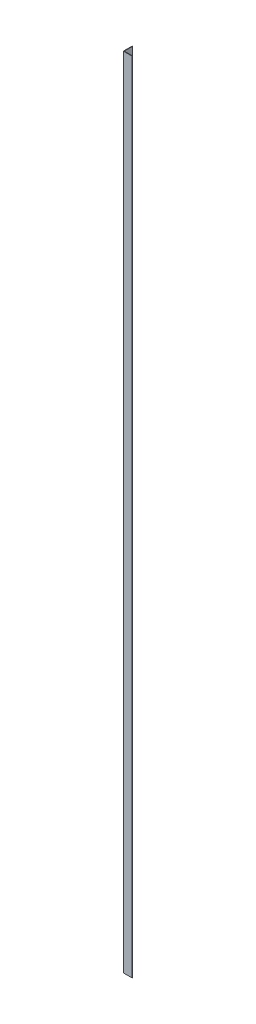
ISO-10303-21;
HEADER;
FILE_DESCRIPTION(('STEP AP214'),'2;1');
FILE_NAME('part.step','',(''),(''),'','','');
FILE_SCHEMA(('AUTOMOTIVE_DESIGN { 1 0 10303 214 1 1 1 1 }'));
ENDSEC;
DATA;
#1=APPLICATION_CONTEXT('core data for automotive mechanical design processes');
#2=APPLICATION_PROTOCOL_DEFINITION('international standard','automotive_design',2000,#1);
#3=PRODUCT_CONTEXT('',#1,'mechanical');
#4=PRODUCT('Part','Part','',(#3));
#5=PRODUCT_RELATED_PRODUCT_CATEGORY('part','',(#4));
#6=PRODUCT_DEFINITION_FORMATION('','',#4);
#7=PRODUCT_DEFINITION_CONTEXT('part definition',#1,'design');
#8=PRODUCT_DEFINITION('design','',#6,#7);
#9=PRODUCT_DEFINITION_SHAPE('','',#8);
#10=(LENGTH_UNIT() NAMED_UNIT(*) SI_UNIT(.MILLI.,.METRE.));
#11=(NAMED_UNIT(*) PLANE_ANGLE_UNIT() SI_UNIT($,.RADIAN.));
#12=(NAMED_UNIT(*) SI_UNIT($,.STERADIAN.) SOLID_ANGLE_UNIT());
#13=UNCERTAINTY_MEASURE_WITH_UNIT(LENGTH_MEASURE(1.E-05),#10,'distance_accuracy_value','');
#14=(GEOMETRIC_REPRESENTATION_CONTEXT(3) GLOBAL_UNCERTAINTY_ASSIGNED_CONTEXT((#13)) GLOBAL_UNIT_ASSIGNED_CONTEXT((#10,
#11,#12)) REPRESENTATION_CONTEXT('',''));
#15=CARTESIAN_POINT('',(0.,0.,0.));
#16=DIRECTION('',(0.,0.,1.));
#17=DIRECTION('',(1.,0.,0.));
#18=AXIS2_PLACEMENT_3D('',#15,#16,#17);
#19=CARTESIAN_POINT('',(1.,1800.,0.));
#20=DIRECTION('',(1.,0.,0.));
#21=DIRECTION('',(0.,0.,-1.));
#22=AXIS2_PLACEMENT_3D('',#19,#20,#21);
#23=PLANE('',#22);
#24=DIRECTION('',(0.,0.,1.));
#25=VECTOR('',#24,1.);
#26=CARTESIAN_POINT('',(1.,0.,0.));
#27=LINE('',#26,#25);
#28=CARTESIAN_POINT('',(1.,0.,-20.));
#29=VERTEX_POINT('',#28);
#30=CARTESIAN_POINT('',(1.,0.,-0.999999999999998));
#31=VERTEX_POINT('',#30);
#32=EDGE_CURVE('E116',#29,#31,#27,.T.);
#33=ORIENTED_EDGE('',*,*,#32,.F.);
#34=DIRECTION('',(0.,-1.,0.));
#35=VECTOR('',#34,1.);
#36=CARTESIAN_POINT('',(1.,1800.,-20.));
#37=LINE('',#36,#35);
#38=CARTESIAN_POINT('',(1.,1800.,-20.));
#39=VERTEX_POINT('',#38);
#40=EDGE_CURVE('E11',#39,#29,#37,.T.);
#41=ORIENTED_EDGE('',*,*,#40,.F.);
#42=DIRECTION('',(0.,0.,1.));
#43=VECTOR('',#42,1.);
#44=CARTESIAN_POINT('',(1.,1800.,0.));
#45=LINE('',#44,#43);
#46=CARTESIAN_POINT('',(1.,1800.,-0.999999999999998));
#47=VERTEX_POINT('',#46);
#48=EDGE_CURVE('E129',#39,#47,#45,.T.);
#49=ORIENTED_EDGE('',*,*,#48,.T.);
#50=DIRECTION('',(0.,-1.,0.));
#51=VECTOR('',#50,1.);
#52=CARTESIAN_POINT('',(1.,1800.,-0.999999999999998));
#53=LINE('',#52,#51);
#54=EDGE_CURVE('E81',#47,#31,#53,.T.);
#55=ORIENTED_EDGE('',*,*,#54,.T.);
#56=EDGE_LOOP('',(#33,#41,#49,#55));
#57=FACE_BOUND('',#56,.T.);
#58=ADVANCED_FACE('F36',(#57),#23,.T.);
#59=CARTESIAN_POINT('',(0.,1800.,-20.));
#60=DIRECTION('',(0.,0.,-1.));
#61=DIRECTION('',(-1.,0.,0.));
#62=AXIS2_PLACEMENT_3D('',#59,#60,#61);
#63=PLANE('',#62);
#64=DIRECTION('',(1.,0.,0.));
#65=VECTOR('',#64,1.);
#66=CARTESIAN_POINT('',(0.,0.,-20.));
#67=LINE('',#66,#65);
#68=CARTESIAN_POINT('',(0.,0.,-20.));
#69=VERTEX_POINT('',#68);
#70=EDGE_CURVE('E119',#69,#29,#67,.T.);
#71=ORIENTED_EDGE('',*,*,#70,.F.);
#72=DIRECTION('',(0.,-1.,0.));
#73=VECTOR('',#72,1.);
#74=CARTESIAN_POINT('',(0.,1800.,-20.));
#75=LINE('',#74,#73);
#76=CARTESIAN_POINT('',(0.,1800.,-20.));
#77=VERTEX_POINT('',#76);
#78=EDGE_CURVE('E44',#77,#69,#75,.T.);
#79=ORIENTED_EDGE('',*,*,#78,.F.);
#80=DIRECTION('',(1.,0.,0.));
#81=VECTOR('',#80,1.);
#82=CARTESIAN_POINT('',(0.,1800.,-20.));
#83=LINE('',#82,#81);
#84=EDGE_CURVE('E144',#77,#39,#83,.T.);
#85=ORIENTED_EDGE('',*,*,#84,.T.);
#86=ORIENTED_EDGE('',*,*,#40,.T.);
#87=EDGE_LOOP('',(#71,#79,#85,#86));
#88=FACE_BOUND('',#87,.T.);
#89=ADVANCED_FACE('F138',(#88),#63,.T.);
#90=CARTESIAN_POINT('',(0.,1800.,0.));
#91=DIRECTION('',(-1.,0.,0.));
#92=DIRECTION('',(0.,0.,1.));
#93=AXIS2_PLACEMENT_3D('',#90,#91,#92);
#94=PLANE('',#93);
#95=DIRECTION('',(0.,0.,-1.));
#96=VECTOR('',#95,1.);
#97=CARTESIAN_POINT('',(0.,0.,0.));
#98=LINE('',#97,#96);
#99=CARTESIAN_POINT('',(0.,0.,0.));
#100=VERTEX_POINT('',#99);
#101=EDGE_CURVE('E122',#100,#69,#98,.T.);
#102=ORIENTED_EDGE('',*,*,#101,.F.);
#103=DIRECTION('',(0.,-1.,0.));
#104=VECTOR('',#103,1.);
#105=CARTESIAN_POINT('',(0.,1800.,0.));
#106=LINE('',#105,#104);
#107=CARTESIAN_POINT('',(0.,1800.,0.));
#108=VERTEX_POINT('',#107);
#109=EDGE_CURVE('E108',#108,#100,#106,.T.);
#110=ORIENTED_EDGE('',*,*,#109,.F.);
#111=DIRECTION('',(0.,0.,-1.));
#112=VECTOR('',#111,1.);
#113=CARTESIAN_POINT('',(0.,1800.,0.));
#114=LINE('',#113,#112);
#115=EDGE_CURVE('E101',#108,#77,#114,.T.);
#116=ORIENTED_EDGE('',*,*,#115,.T.);
#117=ORIENTED_EDGE('',*,*,#78,.T.);
#118=EDGE_LOOP('',(#102,#110,#116,#117));
#119=FACE_BOUND('',#118,.T.);
#120=ADVANCED_FACE('F135',(#119),#94,.T.);
#121=CARTESIAN_POINT('',(0.,1800.,0.));
#122=DIRECTION('',(0.,0.,-1.));
#123=DIRECTION('',(-1.,0.,0.));
#124=AXIS2_PLACEMENT_3D('',#121,#122,#123);
#125=PLANE('',#124);
#126=DIRECTION('',(1.,0.,0.));
#127=VECTOR('',#126,1.);
#128=CARTESIAN_POINT('',(0.,0.,0.));
#129=LINE('',#128,#127);
#130=CARTESIAN_POINT('',(20.,0.,0.));
#131=VERTEX_POINT('',#130);
#132=EDGE_CURVE('E107',#100,#131,#129,.T.);
#133=ORIENTED_EDGE('',*,*,#132,.T.);
#134=DIRECTION('',(0.,-1.,0.));
#135=VECTOR('',#134,1.);
#136=CARTESIAN_POINT('',(20.,1800.,0.));
#137=LINE('',#136,#135);
#138=CARTESIAN_POINT('',(20.,1800.,0.));
#139=VERTEX_POINT('',#138);
#140=EDGE_CURVE('E104',#139,#131,#137,.T.);
#141=ORIENTED_EDGE('',*,*,#140,.F.);
#142=DIRECTION('',(1.,0.,0.));
#143=VECTOR('',#142,1.);
#144=CARTESIAN_POINT('',(0.,1800.,0.));
#145=LINE('',#144,#143);
#146=EDGE_CURVE('E94',#108,#139,#145,.T.);
#147=ORIENTED_EDGE('',*,*,#146,.F.);
#148=ORIENTED_EDGE('',*,*,#109,.T.);
#149=EDGE_LOOP('',(#133,#141,#147,#148));
#150=FACE_BOUND('',#149,.T.);
#151=ADVANCED_FACE('F105',(#150),#125,.F.);
#152=CARTESIAN_POINT('',(20.,1800.,0.));
#153=DIRECTION('',(-1.,0.,0.));
#154=DIRECTION('',(0.,0.,1.));
#155=AXIS2_PLACEMENT_3D('',#152,#153,#154);
#156=PLANE('',#155);
#157=DIRECTION('',(0.,0.,-1.));
#158=VECTOR('',#157,1.);
#159=CARTESIAN_POINT('',(20.,0.,0.));
#160=LINE('',#159,#158);
#161=CARTESIAN_POINT('',(20.,0.,-1.));
#162=VERTEX_POINT('',#161);
#163=EDGE_CURVE('E74',#131,#162,#160,.T.);
#164=ORIENTED_EDGE('',*,*,#163,.T.);
#165=DIRECTION('',(0.,-1.,0.));
#166=VECTOR('',#165,1.);
#167=CARTESIAN_POINT('',(20.,1800.,-1.));
#168=LINE('',#167,#166);
#169=CARTESIAN_POINT('',(20.,1800.,-1.));
#170=VERTEX_POINT('',#169);
#171=EDGE_CURVE('E109',#170,#162,#168,.T.);
#172=ORIENTED_EDGE('',*,*,#171,.F.);
#173=DIRECTION('',(0.,0.,-1.));
#174=VECTOR('',#173,1.);
#175=CARTESIAN_POINT('',(20.,1800.,0.));
#176=LINE('',#175,#174);
#177=EDGE_CURVE('E98',#139,#170,#176,.T.);
#178=ORIENTED_EDGE('',*,*,#177,.F.);
#179=ORIENTED_EDGE('',*,*,#140,.T.);
#180=EDGE_LOOP('',(#164,#172,#178,#179));
#181=FACE_BOUND('',#180,.T.);
#182=ADVANCED_FACE('F111',(#181),#156,.F.);
#183=CARTESIAN_POINT('',(0.,1800.,-0.999999999999997));
#184=DIRECTION('',(0.,0.,1.));
#185=DIRECTION('',(1.,0.,0.));
#186=AXIS2_PLACEMENT_3D('',#183,#184,#185);
#187=PLANE('',#186);
#188=DIRECTION('',(-1.,0.,0.));
#189=VECTOR('',#188,1.);
#190=CARTESIAN_POINT('',(0.,0.,-0.999999999999997));
#191=LINE('',#190,#189);
#192=EDGE_CURVE('E127',#162,#31,#191,.T.);
#193=ORIENTED_EDGE('',*,*,#192,.T.);
#194=ORIENTED_EDGE('',*,*,#54,.F.);
#195=DIRECTION('',(-1.,0.,0.));
#196=VECTOR('',#195,1.);
#197=CARTESIAN_POINT('',(0.,1800.,-0.999999999999997));
#198=LINE('',#197,#196);
#199=EDGE_CURVE('E52',#170,#47,#198,.T.);
#200=ORIENTED_EDGE('',*,*,#199,.F.);
#201=ORIENTED_EDGE('',*,*,#171,.T.);
#202=EDGE_LOOP('',(#193,#194,#200,#201));
#203=FACE_BOUND('',#202,.T.);
#204=ADVANCED_FACE('F143',(#203),#187,.F.);
#205=CARTESIAN_POINT('',(0.,1800.,0.));
#206=DIRECTION('',(0.,1.,0.));
#207=DIRECTION('',(0.,0.,1.));
#208=AXIS2_PLACEMENT_3D('',#205,#206,#207);
#209=PLANE('',#208);
#210=ORIENTED_EDGE('',*,*,#48,.F.);
#211=ORIENTED_EDGE('',*,*,#84,.F.);
#212=ORIENTED_EDGE('',*,*,#115,.F.);
#213=ORIENTED_EDGE('',*,*,#146,.T.);
#214=ORIENTED_EDGE('',*,*,#177,.T.);
#215=ORIENTED_EDGE('',*,*,#199,.T.);
#216=EDGE_LOOP('',(#210,#211,#212,#213,#214,#215));
#217=FACE_BOUND('',#216,.T.);
#218=ADVANCED_FACE('F96',(#217),#209,.T.);
#219=CARTESIAN_POINT('',(0.,0.,0.));
#220=DIRECTION('',(0.,1.,0.));
#221=DIRECTION('',(0.,0.,1.));
#222=AXIS2_PLACEMENT_3D('',#219,#220,#221);
#223=PLANE('',#222);
#224=ORIENTED_EDGE('',*,*,#32,.T.);
#225=ORIENTED_EDGE('',*,*,#192,.F.);
#226=ORIENTED_EDGE('',*,*,#163,.F.);
#227=ORIENTED_EDGE('',*,*,#132,.F.);
#228=ORIENTED_EDGE('',*,*,#101,.T.);
#229=ORIENTED_EDGE('',*,*,#70,.T.);
#230=EDGE_LOOP('',(#224,#225,#226,#227,#228,#229));
#231=FACE_BOUND('',#230,.T.);
#232=ADVANCED_FACE('F140',(#231),#223,.F.);
#233=CLOSED_SHELL('',(#58,#89,#120,#151,#182,#204,#218,#232));
#234=MANIFOLD_SOLID_BREP('B2',#233);
#235=ADVANCED_BREP_SHAPE_REPRESENTATION('',(#18,#234),#14);
#236=SHAPE_DEFINITION_REPRESENTATION(#9,#235);
ENDSEC;
END-ISO-10303-21;
